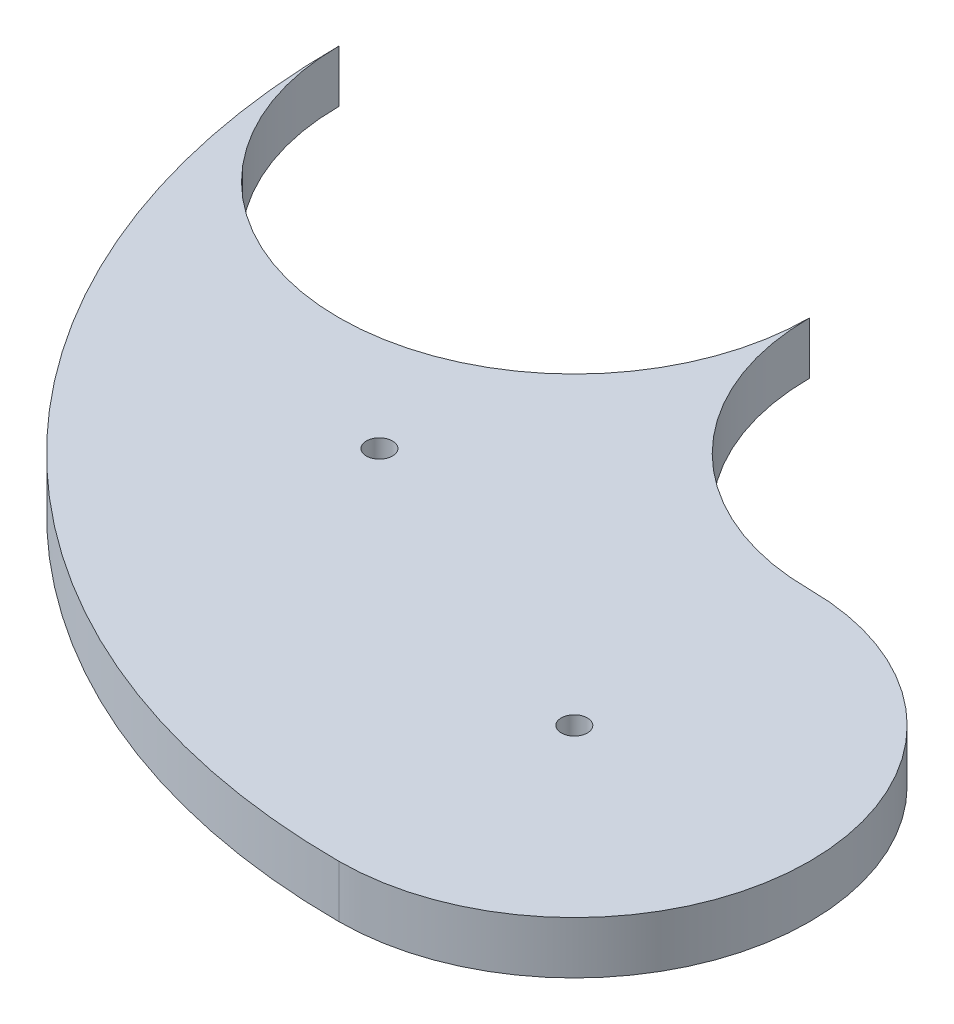
ISO-10303-21;
HEADER;
FILE_DESCRIPTION(('STEP AP214'),'2;1');
FILE_NAME('part.step','',(''),(''),'','','');
FILE_SCHEMA(('AUTOMOTIVE_DESIGN { 1 0 10303 214 1 1 1 1 }'));
ENDSEC;
DATA;
#1=APPLICATION_CONTEXT('core data for automotive mechanical design processes');
#2=APPLICATION_PROTOCOL_DEFINITION('international standard','automotive_design',2000,#1);
#3=PRODUCT_CONTEXT('',#1,'mechanical');
#4=PRODUCT('Part','Part','',(#3));
#5=PRODUCT_RELATED_PRODUCT_CATEGORY('part','',(#4));
#6=PRODUCT_DEFINITION_FORMATION('','',#4);
#7=PRODUCT_DEFINITION_CONTEXT('part definition',#1,'design');
#8=PRODUCT_DEFINITION('design','',#6,#7);
#9=PRODUCT_DEFINITION_SHAPE('','',#8);
#10=(LENGTH_UNIT() NAMED_UNIT(*) SI_UNIT(.MILLI.,.METRE.));
#11=(NAMED_UNIT(*) PLANE_ANGLE_UNIT() SI_UNIT($,.RADIAN.));
#12=(NAMED_UNIT(*) SI_UNIT($,.STERADIAN.) SOLID_ANGLE_UNIT());
#13=UNCERTAINTY_MEASURE_WITH_UNIT(LENGTH_MEASURE(1.E-05),#10,'distance_accuracy_value','');
#14=(GEOMETRIC_REPRESENTATION_CONTEXT(3) GLOBAL_UNCERTAINTY_ASSIGNED_CONTEXT((#13)) GLOBAL_UNIT_ASSIGNED_CONTEXT((#10,
#11,#12)) REPRESENTATION_CONTEXT('',''));
#15=CARTESIAN_POINT('',(0.,0.,0.));
#16=DIRECTION('',(0.,0.,1.));
#17=DIRECTION('',(1.,0.,0.));
#18=AXIS2_PLACEMENT_3D('',#15,#16,#17);
#19=CARTESIAN_POINT('',(0.,-5.,-45.));
#20=DIRECTION('',(0.,1.,0.));
#21=DIRECTION('',(0.,0.,1.));
#22=AXIS2_PLACEMENT_3D('',#19,#20,#21);
#23=CYLINDRICAL_SURFACE('',#22,67.5);
#24=CARTESIAN_POINT('',(0.,0.,-45.));
#25=DIRECTION('',(0.,1.,0.));
#26=DIRECTION('',(0.,0.,1.));
#27=AXIS2_PLACEMENT_3D('',#24,#25,#26);
#28=CIRCLE('',#27,67.5);
#29=CARTESIAN_POINT('',(-67.5,0.,-45.));
#30=VERTEX_POINT('',#29);
#31=CARTESIAN_POINT('',(0.,0.,22.5));
#32=VERTEX_POINT('',#31);
#33=EDGE_CURVE('E103',#30,#32,#28,.T.);
#34=ORIENTED_EDGE('',*,*,#33,.F.);
#35=DIRECTION('',(0.,1.,0.));
#36=VECTOR('',#35,1.);
#37=CARTESIAN_POINT('',(-67.5,-5.,-45.));
#38=LINE('',#37,#36);
#39=CARTESIAN_POINT('',(-67.5,-5.,-45.));
#40=VERTEX_POINT('',#39);
#41=EDGE_CURVE('E11',#40,#30,#38,.T.);
#42=ORIENTED_EDGE('',*,*,#41,.F.);
#43=CARTESIAN_POINT('',(0.,-5.,-45.));
#44=DIRECTION('',(0.,1.,0.));
#45=DIRECTION('',(0.,0.,1.));
#46=AXIS2_PLACEMENT_3D('',#43,#44,#45);
#47=CIRCLE('',#46,67.5);
#48=CARTESIAN_POINT('',(0.,-5.,22.5));
#49=VERTEX_POINT('',#48);
#50=EDGE_CURVE('E97',#40,#49,#47,.T.);
#51=ORIENTED_EDGE('',*,*,#50,.T.);
#52=DIRECTION('',(0.,1.,0.));
#53=VECTOR('',#52,1.);
#54=CARTESIAN_POINT('',(0.,-5.,22.5));
#55=LINE('',#54,#53);
#56=EDGE_CURVE('E40',#49,#32,#55,.T.);
#57=ORIENTED_EDGE('',*,*,#56,.T.);
#58=EDGE_LOOP('',(#34,#42,#51,#57));
#59=FACE_BOUND('',#58,.T.);
#60=ADVANCED_FACE('F37',(#59),#23,.T.);
#61=CARTESIAN_POINT('',(-45.,-5.,-45.));
#62=DIRECTION('',(0.,1.,0.));
#63=DIRECTION('',(0.,0.,1.));
#64=AXIS2_PLACEMENT_3D('',#61,#62,#63);
#65=CYLINDRICAL_SURFACE('',#64,22.5);
#66=CARTESIAN_POINT('',(-45.,0.,-45.));
#67=DIRECTION('',(0.,1.,0.));
#68=DIRECTION('',(0.,0.,1.));
#69=AXIS2_PLACEMENT_3D('',#66,#67,#68);
#70=CIRCLE('',#69,22.5);
#71=CARTESIAN_POINT('',(-22.5,0.,-45.));
#72=VERTEX_POINT('',#71);
#73=EDGE_CURVE('E70',#30,#72,#70,.T.);
#74=ORIENTED_EDGE('',*,*,#73,.T.);
#75=DIRECTION('',(0.,1.,0.));
#76=VECTOR('',#75,1.);
#77=CARTESIAN_POINT('',(-22.5,-5.,-45.));
#78=LINE('',#77,#76);
#79=CARTESIAN_POINT('',(-22.5,-5.,-45.));
#80=VERTEX_POINT('',#79);
#81=EDGE_CURVE('E46',#80,#72,#78,.T.);
#82=ORIENTED_EDGE('',*,*,#81,.F.);
#83=CARTESIAN_POINT('',(-45.,-5.,-45.));
#84=DIRECTION('',(0.,1.,0.));
#85=DIRECTION('',(0.,0.,1.));
#86=AXIS2_PLACEMENT_3D('',#83,#84,#85);
#87=CIRCLE('',#86,22.5);
#88=EDGE_CURVE('E87',#40,#80,#87,.T.);
#89=ORIENTED_EDGE('',*,*,#88,.F.);
#90=ORIENTED_EDGE('',*,*,#41,.T.);
#91=EDGE_LOOP('',(#74,#82,#89,#90));
#92=FACE_BOUND('',#91,.T.);
#93=ADVANCED_FACE('F114',(#92),#65,.F.);
#94=CARTESIAN_POINT('',(0.,-5.,-45.));
#95=DIRECTION('',(0.,1.,0.));
#96=DIRECTION('',(0.,0.,1.));
#97=AXIS2_PLACEMENT_3D('',#94,#95,#96);
#98=CYLINDRICAL_SURFACE('',#97,22.5);
#99=CARTESIAN_POINT('',(0.,0.,-45.));
#100=DIRECTION('',(0.,1.,0.));
#101=DIRECTION('',(0.,0.,1.));
#102=AXIS2_PLACEMENT_3D('',#99,#100,#101);
#103=CIRCLE('',#102,22.5);
#104=CARTESIAN_POINT('',(0.,0.,-22.5));
#105=VERTEX_POINT('',#104);
#106=EDGE_CURVE('E94',#72,#105,#103,.T.);
#107=ORIENTED_EDGE('',*,*,#106,.T.);
#108=DIRECTION('',(0.,1.,0.));
#109=VECTOR('',#108,1.);
#110=CARTESIAN_POINT('',(0.,-5.,-22.5));
#111=LINE('',#110,#109);
#112=CARTESIAN_POINT('',(0.,-5.,-22.5));
#113=VERTEX_POINT('',#112);
#114=EDGE_CURVE('E91',#113,#105,#111,.T.);
#115=ORIENTED_EDGE('',*,*,#114,.F.);
#116=CARTESIAN_POINT('',(0.,-5.,-45.));
#117=DIRECTION('',(0.,1.,0.));
#118=DIRECTION('',(0.,0.,1.));
#119=AXIS2_PLACEMENT_3D('',#116,#117,#118);
#120=CIRCLE('',#119,22.5);
#121=EDGE_CURVE('E82',#80,#113,#120,.T.);
#122=ORIENTED_EDGE('',*,*,#121,.F.);
#123=ORIENTED_EDGE('',*,*,#81,.T.);
#124=EDGE_LOOP('',(#107,#115,#122,#123));
#125=FACE_BOUND('',#124,.T.);
#126=ADVANCED_FACE('F92',(#125),#98,.F.);
#127=CARTESIAN_POINT('',(0.,-5.,0.));
#128=DIRECTION('',(0.,1.,0.));
#129=DIRECTION('',(0.,0.,1.));
#130=AXIS2_PLACEMENT_3D('',#127,#128,#129);
#131=CYLINDRICAL_SURFACE('',#130,22.5);
#132=CARTESIAN_POINT('',(0.,0.,0.));
#133=DIRECTION('',(0.,1.,0.));
#134=DIRECTION('',(0.,0.,1.));
#135=AXIS2_PLACEMENT_3D('',#132,#133,#134);
#136=CIRCLE('',#135,22.5);
#137=EDGE_CURVE('E106',#32,#105,#136,.T.);
#138=ORIENTED_EDGE('',*,*,#137,.F.);
#139=ORIENTED_EDGE('',*,*,#56,.F.);
#140=CARTESIAN_POINT('',(0.,-5.,0.));
#141=DIRECTION('',(0.,1.,0.));
#142=DIRECTION('',(0.,0.,1.));
#143=AXIS2_PLACEMENT_3D('',#140,#141,#142);
#144=CIRCLE('',#143,22.5);
#145=EDGE_CURVE('E86',#49,#113,#144,.T.);
#146=ORIENTED_EDGE('',*,*,#145,.T.);
#147=ORIENTED_EDGE('',*,*,#114,.T.);
#148=EDGE_LOOP('',(#138,#139,#146,#147));
#149=FACE_BOUND('',#148,.T.);
#150=ADVANCED_FACE('F96',(#149),#131,.T.);
#151=CARTESIAN_POINT('',(0.,-5.,-22.5));
#152=DIRECTION('',(0.,1.,0.));
#153=DIRECTION('',(0.,0.,1.));
#154=AXIS2_PLACEMENT_3D('',#151,#152,#153);
#155=PLANE('',#154);
#156=CARTESIAN_POINT('',(-32.2449632395666,-5.,-13.6111111111107));
#157=DIRECTION('',(0.,1.,0.));
#158=DIRECTION('',(0.,0.,1.));
#159=AXIS2_PLACEMENT_3D('',#156,#157,#158);
#160=CIRCLE('',#159,1.24999999999999);
#161=CARTESIAN_POINT('',(-32.2449632395666,-5.,-12.3611111111107));
#162=VERTEX_POINT('',#161);
#163=EDGE_CURVE('E148',#162,#162,#160,.T.);
#164=ORIENTED_EDGE('',*,*,#163,.T.);
#165=EDGE_LOOP('',(#164));
#166=FACE_BOUND('',#165,.T.);
#167=CARTESIAN_POINT('',(0.,-5.,0.));
#168=DIRECTION('',(0.,1.,0.));
#169=DIRECTION('',(0.,0.,1.));
#170=AXIS2_PLACEMENT_3D('',#167,#168,#169);
#171=CIRCLE('',#170,1.24999999999999);
#172=CARTESIAN_POINT('',(0.,-5.,1.24999999999999));
#173=VERTEX_POINT('',#172);
#174=EDGE_CURVE('E107',#173,#173,#171,.T.);
#175=ORIENTED_EDGE('',*,*,#174,.T.);
#176=EDGE_LOOP('',(#175));
#177=FACE_BOUND('',#176,.T.);
#178=ORIENTED_EDGE('',*,*,#50,.F.);
#179=ORIENTED_EDGE('',*,*,#88,.T.);
#180=ORIENTED_EDGE('',*,*,#121,.T.);
#181=ORIENTED_EDGE('',*,*,#145,.F.);
#182=EDGE_LOOP('',(#178,#179,#180,#181));
#183=FACE_BOUND('',#182,.T.);
#184=ADVANCED_FACE('F85',(#166,#177,#183),#155,.F.);
#185=CARTESIAN_POINT('',(0.,0.,-22.5));
#186=DIRECTION('',(0.,1.,0.));
#187=DIRECTION('',(0.,0.,1.));
#188=AXIS2_PLACEMENT_3D('',#185,#186,#187);
#189=PLANE('',#188);
#190=CARTESIAN_POINT('',(-32.2449632395666,0.,-13.6111111111107));
#191=DIRECTION('',(0.,1.,0.));
#192=DIRECTION('',(0.,0.,1.));
#193=AXIS2_PLACEMENT_3D('',#190,#191,#192);
#194=CIRCLE('',#193,1.24999999999999);
#195=CARTESIAN_POINT('',(-32.2449632395666,0.,-12.3611111111107));
#196=VERTEX_POINT('',#195);
#197=EDGE_CURVE('E151',#196,#196,#194,.T.);
#198=ORIENTED_EDGE('',*,*,#197,.F.);
#199=EDGE_LOOP('',(#198));
#200=FACE_BOUND('',#199,.T.);
#201=CARTESIAN_POINT('',(0.,0.,0.));
#202=DIRECTION('',(0.,1.,0.));
#203=DIRECTION('',(0.,0.,1.));
#204=AXIS2_PLACEMENT_3D('',#201,#202,#203);
#205=CIRCLE('',#204,1.24999999999999);
#206=CARTESIAN_POINT('',(0.,0.,1.24999999999999));
#207=VERTEX_POINT('',#206);
#208=EDGE_CURVE('E153',#207,#207,#205,.T.);
#209=ORIENTED_EDGE('',*,*,#208,.F.);
#210=EDGE_LOOP('',(#209));
#211=FACE_BOUND('',#210,.T.);
#212=ORIENTED_EDGE('',*,*,#33,.T.);
#213=ORIENTED_EDGE('',*,*,#137,.T.);
#214=ORIENTED_EDGE('',*,*,#106,.F.);
#215=ORIENTED_EDGE('',*,*,#73,.F.);
#216=EDGE_LOOP('',(#212,#213,#214,#215));
#217=FACE_BOUND('',#216,.T.);
#218=ADVANCED_FACE('F112',(#200,#211,#217),#189,.T.);
#219=CARTESIAN_POINT('',(0.,0.,0.));
#220=DIRECTION('',(0.,1.,0.));
#221=DIRECTION('',(0.,0.,1.));
#222=AXIS2_PLACEMENT_3D('',#219,#220,#221);
#223=CYLINDRICAL_SURFACE('',#222,1.24999999999999);
#224=ORIENTED_EDGE('',*,*,#174,.F.);
#225=EDGE_LOOP('',(#224));
#226=FACE_BOUND('',#225,.T.);
#227=ORIENTED_EDGE('',*,*,#208,.T.);
#228=EDGE_LOOP('',(#227));
#229=FACE_BOUND('',#228,.T.);
#230=ADVANCED_FACE('F133',(#226,#229),#223,.F.);
#231=CARTESIAN_POINT('',(-32.2449632395666,0.,-13.6111111111107));
#232=DIRECTION('',(0.,1.,0.));
#233=DIRECTION('',(0.,0.,1.));
#234=AXIS2_PLACEMENT_3D('',#231,#232,#233);
#235=CYLINDRICAL_SURFACE('',#234,1.24999999999999);
#236=ORIENTED_EDGE('',*,*,#163,.F.);
#237=EDGE_LOOP('',(#236));
#238=FACE_BOUND('',#237,.T.);
#239=ORIENTED_EDGE('',*,*,#197,.T.);
#240=EDGE_LOOP('',(#239));
#241=FACE_BOUND('',#240,.T.);
#242=ADVANCED_FACE('F140',(#238,#241),#235,.F.);
#243=CLOSED_SHELL('',(#60,#93,#126,#150,#184,#218,#230,#242));
#244=MANIFOLD_SOLID_BREP('B2',#243);
#245=ADVANCED_BREP_SHAPE_REPRESENTATION('',(#18,#244),#14);
#246=SHAPE_DEFINITION_REPRESENTATION(#9,#245);
ENDSEC;
END-ISO-10303-21;
